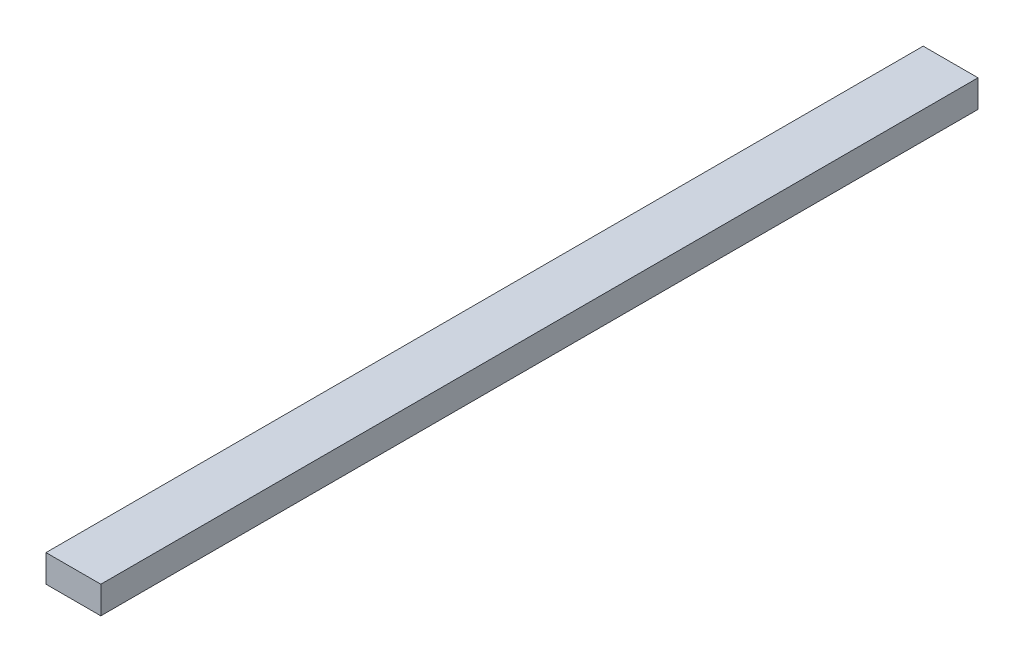
ISO-10303-21;
HEADER;
FILE_DESCRIPTION(('STEP AP214'),'2;1');
FILE_NAME('part.step','',(''),(''),'','','');
FILE_SCHEMA(('AUTOMOTIVE_DESIGN { 1 0 10303 214 1 1 1 1 }'));
ENDSEC;
DATA;
#1=APPLICATION_CONTEXT('core data for automotive mechanical design processes');
#2=APPLICATION_PROTOCOL_DEFINITION('international standard','automotive_design',2000,#1);
#3=PRODUCT_CONTEXT('',#1,'mechanical');
#4=PRODUCT('Part','Part','',(#3));
#5=PRODUCT_RELATED_PRODUCT_CATEGORY('part','',(#4));
#6=PRODUCT_DEFINITION_FORMATION('','',#4);
#7=PRODUCT_DEFINITION_CONTEXT('part definition',#1,'design');
#8=PRODUCT_DEFINITION('design','',#6,#7);
#9=PRODUCT_DEFINITION_SHAPE('','',#8);
#10=(LENGTH_UNIT() NAMED_UNIT(*) SI_UNIT(.MILLI.,.METRE.));
#11=(NAMED_UNIT(*) PLANE_ANGLE_UNIT() SI_UNIT($,.RADIAN.));
#12=(NAMED_UNIT(*) SI_UNIT($,.STERADIAN.) SOLID_ANGLE_UNIT());
#13=UNCERTAINTY_MEASURE_WITH_UNIT(LENGTH_MEASURE(1.E-05),#10,'distance_accuracy_value','');
#14=(GEOMETRIC_REPRESENTATION_CONTEXT(3) GLOBAL_UNCERTAINTY_ASSIGNED_CONTEXT((#13)) GLOBAL_UNIT_ASSIGNED_CONTEXT((#10,
#11,#12)) REPRESENTATION_CONTEXT('',''));
#15=CARTESIAN_POINT('',(0.,0.,0.));
#16=DIRECTION('',(0.,0.,1.));
#17=DIRECTION('',(1.,0.,0.));
#18=AXIS2_PLACEMENT_3D('',#15,#16,#17);
#19=CARTESIAN_POINT('',(15.,7.5,480.));
#20=DIRECTION('',(-1.,0.,0.));
#21=DIRECTION('',(0.,-1.,0.));
#22=AXIS2_PLACEMENT_3D('',#19,#20,#21);
#23=PLANE('',#22);
#24=DIRECTION('',(0.,1.,0.));
#25=VECTOR('',#24,1.);
#26=CARTESIAN_POINT('',(15.,7.5,0.));
#27=LINE('',#26,#25);
#28=CARTESIAN_POINT('',(15.,-7.5,0.));
#29=VERTEX_POINT('',#28);
#30=CARTESIAN_POINT('',(15.,7.5,0.));
#31=VERTEX_POINT('',#30);
#32=EDGE_CURVE('E107',#29,#31,#27,.T.);
#33=ORIENTED_EDGE('',*,*,#32,.T.);
#34=DIRECTION('',(0.,0.,-1.));
#35=VECTOR('',#34,1.);
#36=CARTESIAN_POINT('',(15.,7.5,480.));
#37=LINE('',#36,#35);
#38=CARTESIAN_POINT('',(15.,7.5,480.));
#39=VERTEX_POINT('',#38);
#40=EDGE_CURVE('E11',#39,#31,#37,.T.);
#41=ORIENTED_EDGE('',*,*,#40,.F.);
#42=DIRECTION('',(0.,1.,0.));
#43=VECTOR('',#42,1.);
#44=CARTESIAN_POINT('',(15.,7.5,480.));
#45=LINE('',#44,#43);
#46=CARTESIAN_POINT('',(15.,-7.5,480.));
#47=VERTEX_POINT('',#46);
#48=EDGE_CURVE('E91',#47,#39,#45,.T.);
#49=ORIENTED_EDGE('',*,*,#48,.F.);
#50=DIRECTION('',(0.,0.,-1.));
#51=VECTOR('',#50,1.);
#52=CARTESIAN_POINT('',(15.,-7.5,480.));
#53=LINE('',#52,#51);
#54=EDGE_CURVE('E103',#47,#29,#53,.T.);
#55=ORIENTED_EDGE('',*,*,#54,.T.);
#56=EDGE_LOOP('',(#33,#41,#49,#55));
#57=FACE_BOUND('',#56,.T.);
#58=ADVANCED_FACE('F39',(#57),#23,.F.);
#59=CARTESIAN_POINT('',(-15.,7.5,480.));
#60=DIRECTION('',(0.,-1.,0.));
#61=DIRECTION('',(0.,0.,-1.));
#62=AXIS2_PLACEMENT_3D('',#59,#60,#61);
#63=PLANE('',#62);
#64=DIRECTION('',(-1.,0.,0.));
#65=VECTOR('',#64,1.);
#66=CARTESIAN_POINT('',(-15.,7.5,0.));
#67=LINE('',#66,#65);
#68=CARTESIAN_POINT('',(-15.,7.5,0.));
#69=VERTEX_POINT('',#68);
#70=EDGE_CURVE('E96',#31,#69,#67,.T.);
#71=ORIENTED_EDGE('',*,*,#70,.T.);
#72=DIRECTION('',(0.,0.,-1.));
#73=VECTOR('',#72,1.);
#74=CARTESIAN_POINT('',(-15.,7.5,480.));
#75=LINE('',#74,#73);
#76=CARTESIAN_POINT('',(-15.,7.5,480.));
#77=VERTEX_POINT('',#76);
#78=EDGE_CURVE('E48',#77,#69,#75,.T.);
#79=ORIENTED_EDGE('',*,*,#78,.F.);
#80=DIRECTION('',(-1.,0.,0.));
#81=VECTOR('',#80,1.);
#82=CARTESIAN_POINT('',(-15.,7.5,480.));
#83=LINE('',#82,#81);
#84=EDGE_CURVE('E86',#39,#77,#83,.T.);
#85=ORIENTED_EDGE('',*,*,#84,.F.);
#86=ORIENTED_EDGE('',*,*,#40,.T.);
#87=EDGE_LOOP('',(#71,#79,#85,#86));
#88=FACE_BOUND('',#87,.T.);
#89=ADVANCED_FACE('F95',(#88),#63,.F.);
#90=CARTESIAN_POINT('',(-15.,7.5,480.));
#91=DIRECTION('',(1.,0.,0.));
#92=DIRECTION('',(0.,1.,0.));
#93=AXIS2_PLACEMENT_3D('',#90,#91,#92);
#94=PLANE('',#93);
#95=DIRECTION('',(0.,-1.,0.));
#96=VECTOR('',#95,1.);
#97=CARTESIAN_POINT('',(-15.,7.5,0.));
#98=LINE('',#97,#96);
#99=CARTESIAN_POINT('',(-15.,-7.5,0.));
#100=VERTEX_POINT('',#99);
#101=EDGE_CURVE('E73',#69,#100,#98,.T.);
#102=ORIENTED_EDGE('',*,*,#101,.T.);
#103=DIRECTION('',(0.,0.,-1.));
#104=VECTOR('',#103,1.);
#105=CARTESIAN_POINT('',(-15.,-7.5,480.));
#106=LINE('',#105,#104);
#107=CARTESIAN_POINT('',(-15.,-7.5,480.));
#108=VERTEX_POINT('',#107);
#109=EDGE_CURVE('E98',#108,#100,#106,.T.);
#110=ORIENTED_EDGE('',*,*,#109,.F.);
#111=DIRECTION('',(0.,-1.,0.));
#112=VECTOR('',#111,1.);
#113=CARTESIAN_POINT('',(-15.,7.5,480.));
#114=LINE('',#113,#112);
#115=EDGE_CURVE('E89',#77,#108,#114,.T.);
#116=ORIENTED_EDGE('',*,*,#115,.F.);
#117=ORIENTED_EDGE('',*,*,#78,.T.);
#118=EDGE_LOOP('',(#102,#110,#116,#117));
#119=FACE_BOUND('',#118,.T.);
#120=ADVANCED_FACE('F99',(#119),#94,.F.);
#121=CARTESIAN_POINT('',(-15.,-7.5,480.));
#122=DIRECTION('',(0.,1.,0.));
#123=DIRECTION('',(0.,0.,1.));
#124=AXIS2_PLACEMENT_3D('',#121,#122,#123);
#125=PLANE('',#124);
#126=DIRECTION('',(1.,0.,0.));
#127=VECTOR('',#126,1.);
#128=CARTESIAN_POINT('',(-15.,-7.5,0.));
#129=LINE('',#128,#127);
#130=EDGE_CURVE('E79',#100,#29,#129,.T.);
#131=ORIENTED_EDGE('',*,*,#130,.T.);
#132=ORIENTED_EDGE('',*,*,#54,.F.);
#133=DIRECTION('',(1.,0.,0.));
#134=VECTOR('',#133,1.);
#135=CARTESIAN_POINT('',(-15.,-7.5,480.));
#136=LINE('',#135,#134);
#137=EDGE_CURVE('E56',#108,#47,#136,.T.);
#138=ORIENTED_EDGE('',*,*,#137,.F.);
#139=ORIENTED_EDGE('',*,*,#109,.T.);
#140=EDGE_LOOP('',(#131,#132,#138,#139));
#141=FACE_BOUND('',#140,.T.);
#142=ADVANCED_FACE('F120',(#141),#125,.F.);
#143=CARTESIAN_POINT('',(0.,0.,480.));
#144=DIRECTION('',(0.,0.,1.));
#145=DIRECTION('',(1.,0.,0.));
#146=AXIS2_PLACEMENT_3D('',#143,#144,#145);
#147=PLANE('',#146);
#148=ORIENTED_EDGE('',*,*,#48,.T.);
#149=ORIENTED_EDGE('',*,*,#84,.T.);
#150=ORIENTED_EDGE('',*,*,#115,.T.);
#151=ORIENTED_EDGE('',*,*,#137,.T.);
#152=EDGE_LOOP('',(#148,#149,#150,#151));
#153=FACE_BOUND('',#152,.T.);
#154=ADVANCED_FACE('F87',(#153),#147,.T.);
#155=CARTESIAN_POINT('',(0.,0.,0.));
#156=DIRECTION('',(0.,0.,1.));
#157=DIRECTION('',(1.,0.,0.));
#158=AXIS2_PLACEMENT_3D('',#155,#156,#157);
#159=PLANE('',#158);
#160=ORIENTED_EDGE('',*,*,#32,.F.);
#161=ORIENTED_EDGE('',*,*,#130,.F.);
#162=ORIENTED_EDGE('',*,*,#101,.F.);
#163=ORIENTED_EDGE('',*,*,#70,.F.);
#164=EDGE_LOOP('',(#160,#161,#162,#163));
#165=FACE_BOUND('',#164,.T.);
#166=ADVANCED_FACE('F123',(#165),#159,.F.);
#167=CLOSED_SHELL('',(#58,#89,#120,#142,#154,#166));
#168=MANIFOLD_SOLID_BREP('B2',#167);
#169=ADVANCED_BREP_SHAPE_REPRESENTATION('',(#18,#168),#14);
#170=SHAPE_DEFINITION_REPRESENTATION(#9,#169);
ENDSEC;
END-ISO-10303-21;
